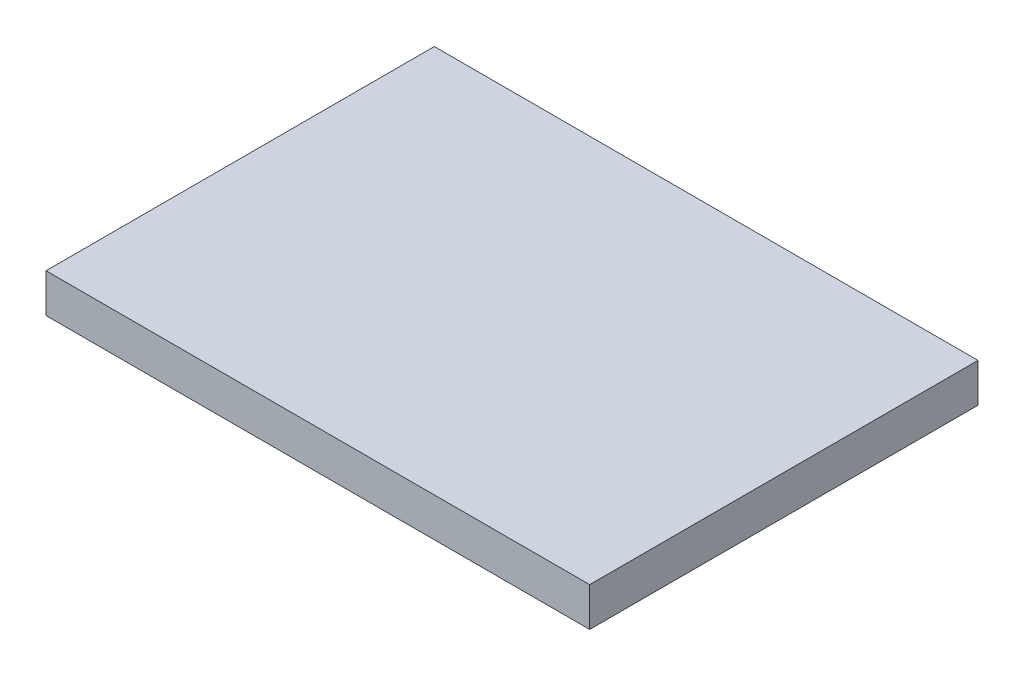
ISO-10303-21;
HEADER;
FILE_DESCRIPTION(('STEP AP214'),'2;1');
FILE_NAME('part.step','',(''),(''),'','','');
FILE_SCHEMA(('AUTOMOTIVE_DESIGN { 1 0 10303 214 1 1 1 1 }'));
ENDSEC;
DATA;
#1=APPLICATION_CONTEXT('core data for automotive mechanical design processes');
#2=APPLICATION_PROTOCOL_DEFINITION('international standard','automotive_design',2000,#1);
#3=PRODUCT_CONTEXT('',#1,'mechanical');
#4=PRODUCT('Part','Part','',(#3));
#5=PRODUCT_RELATED_PRODUCT_CATEGORY('part','',(#4));
#6=PRODUCT_DEFINITION_FORMATION('','',#4);
#7=PRODUCT_DEFINITION_CONTEXT('part definition',#1,'design');
#8=PRODUCT_DEFINITION('design','',#6,#7);
#9=PRODUCT_DEFINITION_SHAPE('','',#8);
#10=(LENGTH_UNIT() NAMED_UNIT(*) SI_UNIT(.MILLI.,.METRE.));
#11=(NAMED_UNIT(*) PLANE_ANGLE_UNIT() SI_UNIT($,.RADIAN.));
#12=(NAMED_UNIT(*) SI_UNIT($,.STERADIAN.) SOLID_ANGLE_UNIT());
#13=UNCERTAINTY_MEASURE_WITH_UNIT(LENGTH_MEASURE(1.E-05),#10,'distance_accuracy_value','');
#14=(GEOMETRIC_REPRESENTATION_CONTEXT(3) GLOBAL_UNCERTAINTY_ASSIGNED_CONTEXT((#13)) GLOBAL_UNIT_ASSIGNED_CONTEXT((#10,
#11,#12)) REPRESENTATION_CONTEXT('',''));
#15=CARTESIAN_POINT('',(0.,0.,0.));
#16=DIRECTION('',(0.,0.,1.));
#17=DIRECTION('',(1.,0.,0.));
#18=AXIS2_PLACEMENT_3D('',#15,#16,#17);
#19=CARTESIAN_POINT('',(35.,-6.5,12.5));
#20=DIRECTION('',(0.,1.,0.));
#21=DIRECTION('',(0.,0.,1.));
#22=AXIS2_PLACEMENT_3D('',#19,#20,#21);
#23=PLANE('',#22);
#24=DIRECTION('',(0.,0.,-1.));
#25=VECTOR('',#24,1.);
#26=CARTESIAN_POINT('',(0.,-6.5,0.));
#27=LINE('',#26,#25);
#28=CARTESIAN_POINT('',(0.,-6.5,12.5));
#29=VERTEX_POINT('',#28);
#30=CARTESIAN_POINT('',(0.,-6.5,-12.5));
#31=VERTEX_POINT('',#30);
#32=EDGE_CURVE('E51',#29,#31,#27,.T.);
#33=ORIENTED_EDGE('',*,*,#32,.F.);
#34=DIRECTION('',(1.,0.,0.));
#35=VECTOR('',#34,1.);
#36=CARTESIAN_POINT('',(35.,-6.5,12.5));
#37=LINE('',#36,#35);
#38=CARTESIAN_POINT('',(35.,-6.5,12.5));
#39=VERTEX_POINT('',#38);
#40=EDGE_CURVE('E11',#29,#39,#37,.T.);
#41=ORIENTED_EDGE('',*,*,#40,.T.);
#42=DIRECTION('',(0.,0.,-1.));
#43=VECTOR('',#42,1.);
#44=CARTESIAN_POINT('',(35.,-6.5,0.));
#45=LINE('',#44,#43);
#46=CARTESIAN_POINT('',(35.,-6.5,-12.5));
#47=VERTEX_POINT('',#46);
#48=EDGE_CURVE('E59',#39,#47,#45,.T.);
#49=ORIENTED_EDGE('',*,*,#48,.T.);
#50=DIRECTION('',(-1.,0.,0.));
#51=VECTOR('',#50,1.);
#52=CARTESIAN_POINT('',(35.,-6.5,-12.5));
#53=LINE('',#52,#51);
#54=EDGE_CURVE('E45',#47,#31,#53,.T.);
#55=ORIENTED_EDGE('',*,*,#54,.T.);
#56=EDGE_LOOP('',(#33,#41,#49,#55));
#57=FACE_BOUND('',#56,.T.);
#58=ADVANCED_FACE('F37',(#57),#23,.T.);
#59=CARTESIAN_POINT('',(35.,-9.,-12.5));
#60=DIRECTION('',(0.,0.,1.));
#61=DIRECTION('',(1.,0.,0.));
#62=AXIS2_PLACEMENT_3D('',#59,#60,#61);
#63=PLANE('',#62);
#64=ORIENTED_EDGE('',*,*,#54,.F.);
#65=DIRECTION('',(0.,1.,0.));
#66=VECTOR('',#65,1.);
#67=CARTESIAN_POINT('',(35.,-9.,-12.5));
#68=LINE('',#67,#66);
#69=CARTESIAN_POINT('',(35.,-9.,-12.5));
#70=VERTEX_POINT('',#69);
#71=EDGE_CURVE('E83',#70,#47,#68,.T.);
#72=ORIENTED_EDGE('',*,*,#71,.F.);
#73=DIRECTION('',(-1.,0.,0.));
#74=VECTOR('',#73,1.);
#75=CARTESIAN_POINT('',(35.,-9.,-12.5));
#76=LINE('',#75,#74);
#77=CARTESIAN_POINT('',(0.,-9.,-12.5));
#78=VERTEX_POINT('',#77);
#79=EDGE_CURVE('E91',#70,#78,#76,.T.);
#80=ORIENTED_EDGE('',*,*,#79,.T.);
#81=DIRECTION('',(0.,1.,0.));
#82=VECTOR('',#81,1.);
#83=CARTESIAN_POINT('',(0.,-9.,-12.5));
#84=LINE('',#83,#82);
#85=EDGE_CURVE('E100',#78,#31,#84,.T.);
#86=ORIENTED_EDGE('',*,*,#85,.T.);
#87=EDGE_LOOP('',(#64,#72,#80,#86));
#88=FACE_BOUND('',#87,.T.);
#89=ADVANCED_FACE('F39',(#88),#63,.F.);
#90=CARTESIAN_POINT('',(35.,-9.,12.5));
#91=DIRECTION('',(0.,1.,0.));
#92=DIRECTION('',(0.,0.,1.));
#93=AXIS2_PLACEMENT_3D('',#90,#91,#92);
#94=PLANE('',#93);
#95=DIRECTION('',(0.,0.,-1.));
#96=VECTOR('',#95,1.);
#97=CARTESIAN_POINT('',(0.,-9.,12.5));
#98=LINE('',#97,#96);
#99=CARTESIAN_POINT('',(0.,-9.,12.5));
#100=VERTEX_POINT('',#99);
#101=EDGE_CURVE('E104',#100,#78,#98,.T.);
#102=ORIENTED_EDGE('',*,*,#101,.T.);
#103=ORIENTED_EDGE('',*,*,#79,.F.);
#104=DIRECTION('',(0.,0.,-1.));
#105=VECTOR('',#104,1.);
#106=CARTESIAN_POINT('',(35.,-9.,12.5));
#107=LINE('',#106,#105);
#108=CARTESIAN_POINT('',(35.,-9.,12.5));
#109=VERTEX_POINT('',#108);
#110=EDGE_CURVE('E79',#109,#70,#107,.T.);
#111=ORIENTED_EDGE('',*,*,#110,.F.);
#112=DIRECTION('',(-1.,0.,0.));
#113=VECTOR('',#112,1.);
#114=CARTESIAN_POINT('',(35.,-9.,12.5));
#115=LINE('',#114,#113);
#116=EDGE_CURVE('E86',#109,#100,#115,.T.);
#117=ORIENTED_EDGE('',*,*,#116,.T.);
#118=EDGE_LOOP('',(#102,#103,#111,#117));
#119=FACE_BOUND('',#118,.T.);
#120=ADVANCED_FACE('F93',(#119),#94,.F.);
#121=CARTESIAN_POINT('',(35.,-9.,12.5));
#122=DIRECTION('',(0.,0.,-1.));
#123=DIRECTION('',(-1.,0.,0.));
#124=AXIS2_PLACEMENT_3D('',#121,#122,#123);
#125=PLANE('',#124);
#126=ORIENTED_EDGE('',*,*,#40,.F.);
#127=DIRECTION('',(0.,-1.,0.));
#128=VECTOR('',#127,1.);
#129=CARTESIAN_POINT('',(0.,-9.,12.5));
#130=LINE('',#129,#128);
#131=EDGE_CURVE('E88',#29,#100,#130,.T.);
#132=ORIENTED_EDGE('',*,*,#131,.T.);
#133=ORIENTED_EDGE('',*,*,#116,.F.);
#134=DIRECTION('',(0.,-1.,0.));
#135=VECTOR('',#134,1.);
#136=CARTESIAN_POINT('',(35.,-9.,12.5));
#137=LINE('',#136,#135);
#138=EDGE_CURVE('E75',#39,#109,#137,.T.);
#139=ORIENTED_EDGE('',*,*,#138,.F.);
#140=EDGE_LOOP('',(#126,#132,#133,#139));
#141=FACE_BOUND('',#140,.T.);
#142=ADVANCED_FACE('F87',(#141),#125,.F.);
#143=CARTESIAN_POINT('',(35.,0.,0.));
#144=DIRECTION('',(-1.,0.,0.));
#145=DIRECTION('',(0.,0.,1.));
#146=AXIS2_PLACEMENT_3D('',#143,#144,#145);
#147=PLANE('',#146);
#148=ORIENTED_EDGE('',*,*,#48,.F.);
#149=ORIENTED_EDGE('',*,*,#138,.T.);
#150=ORIENTED_EDGE('',*,*,#110,.T.);
#151=ORIENTED_EDGE('',*,*,#71,.T.);
#152=EDGE_LOOP('',(#148,#149,#150,#151));
#153=FACE_BOUND('',#152,.T.);
#154=ADVANCED_FACE('F77',(#153),#147,.F.);
#155=CARTESIAN_POINT('',(0.,0.,0.));
#156=DIRECTION('',(-1.,0.,0.));
#157=DIRECTION('',(0.,0.,1.));
#158=AXIS2_PLACEMENT_3D('',#155,#156,#157);
#159=PLANE('',#158);
#160=ORIENTED_EDGE('',*,*,#131,.F.);
#161=ORIENTED_EDGE('',*,*,#32,.T.);
#162=ORIENTED_EDGE('',*,*,#85,.F.);
#163=ORIENTED_EDGE('',*,*,#101,.F.);
#164=EDGE_LOOP('',(#160,#161,#162,#163));
#165=FACE_BOUND('',#164,.T.);
#166=ADVANCED_FACE('F109',(#165),#159,.T.);
#167=CLOSED_SHELL('',(#58,#89,#120,#142,#154,#166));
#168=MANIFOLD_SOLID_BREP('B2',#167);
#169=ADVANCED_BREP_SHAPE_REPRESENTATION('',(#18,#168),#14);
#170=SHAPE_DEFINITION_REPRESENTATION(#9,#169);
ENDSEC;
END-ISO-10303-21;
